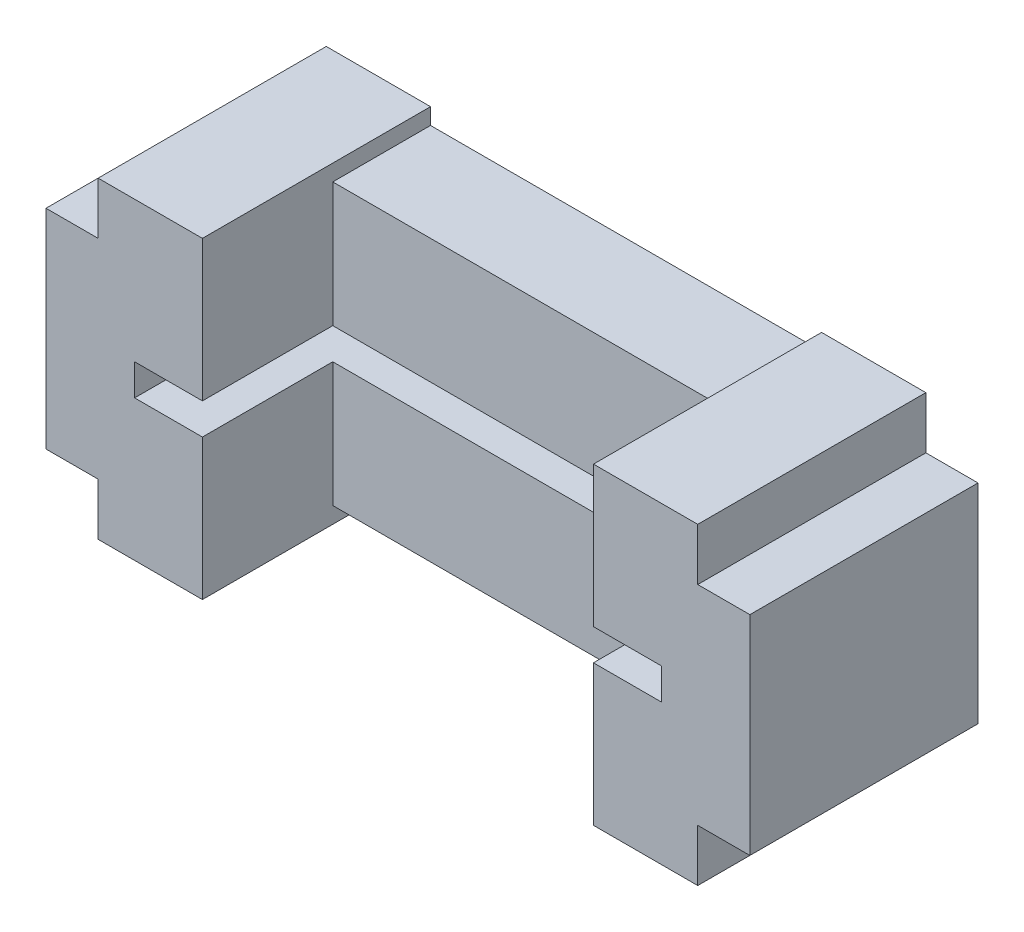
ISO-10303-21;
HEADER;
FILE_DESCRIPTION(('STEP AP214'),'2;1');
FILE_NAME('part.step','',(''),(''),'','','');
FILE_SCHEMA(('AUTOMOTIVE_DESIGN { 1 0 10303 214 1 1 1 1 }'));
ENDSEC;
DATA;
#1=APPLICATION_CONTEXT('core data for automotive mechanical design processes');
#2=APPLICATION_PROTOCOL_DEFINITION('international standard','automotive_design',2000,#1);
#3=PRODUCT_CONTEXT('',#1,'mechanical');
#4=PRODUCT('Part','Part','',(#3));
#5=PRODUCT_RELATED_PRODUCT_CATEGORY('part','',(#4));
#6=PRODUCT_DEFINITION_FORMATION('','',#4);
#7=PRODUCT_DEFINITION_CONTEXT('part definition',#1,'design');
#8=PRODUCT_DEFINITION('design','',#6,#7);
#9=PRODUCT_DEFINITION_SHAPE('','',#8);
#10=(LENGTH_UNIT() NAMED_UNIT(*) SI_UNIT(.MILLI.,.METRE.));
#11=(NAMED_UNIT(*) PLANE_ANGLE_UNIT() SI_UNIT($,.RADIAN.));
#12=(NAMED_UNIT(*) SI_UNIT($,.STERADIAN.) SOLID_ANGLE_UNIT());
#13=UNCERTAINTY_MEASURE_WITH_UNIT(LENGTH_MEASURE(1.E-05),#10,'distance_accuracy_value','');
#14=(GEOMETRIC_REPRESENTATION_CONTEXT(3) GLOBAL_UNCERTAINTY_ASSIGNED_CONTEXT((#13)) GLOBAL_UNIT_ASSIGNED_CONTEXT((#10,
#11,#12)) REPRESENTATION_CONTEXT('',''));
#15=CARTESIAN_POINT('',(0.,0.,0.));
#16=DIRECTION('',(0.,0.,1.));
#17=DIRECTION('',(1.,0.,0.));
#18=AXIS2_PLACEMENT_3D('',#15,#16,#17);
#19=CARTESIAN_POINT('',(-29.21,-15.24,9.525));
#20=DIRECTION('',(0.,1.,0.));
#21=DIRECTION('',(-1.,0.,0.));
#22=AXIS2_PLACEMENT_3D('',#19,#20,#21);
#23=PLANE('',#22);
#24=DIRECTION('',(1.,0.,0.));
#25=VECTOR('',#24,1.);
#26=CARTESIAN_POINT('',(-29.21,-15.24,0.));
#27=LINE('',#26,#25);
#28=CARTESIAN_POINT('',(-29.21,-15.24,0.));
#29=VERTEX_POINT('',#28);
#30=CARTESIAN_POINT('',(-19.05,-15.24,0.));
#31=VERTEX_POINT('',#30);
#32=EDGE_CURVE('E385',#29,#31,#27,.T.);
#33=ORIENTED_EDGE('',*,*,#32,.T.);
#34=DIRECTION('',(0.,0.,-1.));
#35=VECTOR('',#34,1.);
#36=CARTESIAN_POINT('',(-19.05,-15.24,22.225));
#37=LINE('',#36,#35);
#38=CARTESIAN_POINT('',(-19.05,-15.24,22.225));
#39=VERTEX_POINT('',#38);
#40=EDGE_CURVE('E358',#39,#31,#37,.T.);
#41=ORIENTED_EDGE('',*,*,#40,.F.);
#42=DIRECTION('',(1.,0.,0.));
#43=VECTOR('',#42,1.);
#44=CARTESIAN_POINT('',(-29.21,-15.24,22.225));
#45=LINE('',#44,#43);
#46=CARTESIAN_POINT('',(-29.21,-15.24,22.225));
#47=VERTEX_POINT('',#46);
#48=EDGE_CURVE('E356',#47,#39,#45,.T.);
#49=ORIENTED_EDGE('',*,*,#48,.F.);
#50=DIRECTION('',(0.,0.,-1.));
#51=VECTOR('',#50,1.);
#52=CARTESIAN_POINT('',(-29.21,-15.24,9.525));
#53=LINE('',#52,#51);
#54=EDGE_CURVE('E422',#47,#29,#53,.T.);
#55=ORIENTED_EDGE('',*,*,#54,.T.);
#56=EDGE_LOOP('',(#33,#41,#49,#55));
#57=FACE_BOUND('',#56,.T.);
#58=ADVANCED_FACE('F33',(#57),#23,.F.);
#59=CARTESIAN_POINT('',(-29.21,15.24,9.525));
#60=DIRECTION('',(0.,-1.,0.));
#61=DIRECTION('',(1.,0.,0.));
#62=AXIS2_PLACEMENT_3D('',#59,#60,#61);
#63=PLANE('',#62);
#64=DIRECTION('',(0.,0.,-1.));
#65=VECTOR('',#64,1.);
#66=CARTESIAN_POINT('',(-19.05,15.24,22.225));
#67=LINE('',#66,#65);
#68=CARTESIAN_POINT('',(-19.05,15.24,22.225));
#69=VERTEX_POINT('',#68);
#70=CARTESIAN_POINT('',(-19.05,15.24,0.));
#71=VERTEX_POINT('',#70);
#72=EDGE_CURVE('E362',#69,#71,#67,.T.);
#73=ORIENTED_EDGE('',*,*,#72,.T.);
#74=DIRECTION('',(-1.,0.,0.));
#75=VECTOR('',#74,1.);
#76=CARTESIAN_POINT('',(-29.21,15.24,0.));
#77=LINE('',#76,#75);
#78=CARTESIAN_POINT('',(-29.21,15.24,0.));
#79=VERTEX_POINT('',#78);
#80=EDGE_CURVE('E240',#71,#79,#77,.T.);
#81=ORIENTED_EDGE('',*,*,#80,.T.);
#82=DIRECTION('',(0.,0.,-1.));
#83=VECTOR('',#82,1.);
#84=CARTESIAN_POINT('',(-29.21,15.24,9.525));
#85=LINE('',#84,#83);
#86=CARTESIAN_POINT('',(-29.21,15.24,22.225));
#87=VERTEX_POINT('',#86);
#88=EDGE_CURVE('E401',#87,#79,#85,.T.);
#89=ORIENTED_EDGE('',*,*,#88,.F.);
#90=DIRECTION('',(-1.,0.,0.));
#91=VECTOR('',#90,1.);
#92=CARTESIAN_POINT('',(-29.21,15.24,22.225));
#93=LINE('',#92,#91);
#94=EDGE_CURVE('E338',#69,#87,#93,.T.);
#95=ORIENTED_EDGE('',*,*,#94,.F.);
#96=EDGE_LOOP('',(#73,#81,#89,#95));
#97=FACE_BOUND('',#96,.T.);
#98=ADVANCED_FACE('F474',(#97),#63,.F.);
#99=CARTESIAN_POINT('',(0.,0.,9.525));
#100=DIRECTION('',(0.,0.,1.));
#101=DIRECTION('',(1.,0.,0.));
#102=AXIS2_PLACEMENT_3D('',#99,#100,#101);
#103=PLANE('',#102);
#104=DIRECTION('',(1.,0.,0.));
#105=VECTOR('',#104,1.);
#106=CARTESIAN_POINT('',(0.,13.6525,9.525));
#107=LINE('',#106,#105);
#108=CARTESIAN_POINT('',(-19.05,13.6525,9.525));
#109=VERTEX_POINT('',#108);
#110=CARTESIAN_POINT('',(19.05,13.6525,9.525));
#111=VERTEX_POINT('',#110);
#112=EDGE_CURVE('E248',#109,#111,#107,.T.);
#113=ORIENTED_EDGE('',*,*,#112,.F.);
#114=DIRECTION('',(0.,1.,0.));
#115=VECTOR('',#114,1.);
#116=CARTESIAN_POINT('',(-19.05,15.24,9.525));
#117=LINE('',#116,#115);
#118=CARTESIAN_POINT('',(-19.05,1.524,9.525));
#119=VERTEX_POINT('',#118);
#120=EDGE_CURVE('E228',#119,#109,#117,.T.);
#121=ORIENTED_EDGE('',*,*,#120,.F.);
#122=DIRECTION('',(-1.,0.,0.));
#123=VECTOR('',#122,1.);
#124=CARTESIAN_POINT('',(-25.654,1.524,9.525));
#125=LINE('',#124,#123);
#126=CARTESIAN_POINT('',(19.05,1.524,9.525));
#127=VERTEX_POINT('',#126);
#128=EDGE_CURVE('E266',#127,#119,#125,.T.);
#129=ORIENTED_EDGE('',*,*,#128,.F.);
#130=DIRECTION('',(0.,-1.,0.));
#131=VECTOR('',#130,1.);
#132=CARTESIAN_POINT('',(19.05,15.24,9.525));
#133=LINE('',#132,#131);
#134=EDGE_CURVE('E282',#111,#127,#133,.T.);
#135=ORIENTED_EDGE('',*,*,#134,.F.);
#136=EDGE_LOOP('',(#113,#121,#129,#135));
#137=FACE_BOUND('',#136,.T.);
#138=ADVANCED_FACE('F491',(#137),#103,.T.);
#139=DIRECTION('',(-1.,0.,0.));
#140=VECTOR('',#139,1.);
#141=CARTESIAN_POINT('',(0.,-13.6525,9.525));
#142=LINE('',#141,#140);
#143=CARTESIAN_POINT('',(19.05,-13.6525,9.525));
#144=VERTEX_POINT('',#143);
#145=CARTESIAN_POINT('',(-19.05,-13.6525,9.525));
#146=VERTEX_POINT('',#145);
#147=EDGE_CURVE('E259',#144,#146,#142,.T.);
#148=ORIENTED_EDGE('',*,*,#147,.F.);
#149=DIRECTION('',(0.,-1.,0.));
#150=VECTOR('',#149,1.);
#151=CARTESIAN_POINT('',(19.05,-1.524,9.525));
#152=LINE('',#151,#150);
#153=CARTESIAN_POINT('',(19.05,-1.524,9.525));
#154=VERTEX_POINT('',#153);
#155=EDGE_CURVE('E275',#154,#144,#152,.T.);
#156=ORIENTED_EDGE('',*,*,#155,.F.);
#157=DIRECTION('',(1.,0.,0.));
#158=VECTOR('',#157,1.);
#159=CARTESIAN_POINT('',(-25.654,-1.524,9.525));
#160=LINE('',#159,#158);
#161=CARTESIAN_POINT('',(-19.05,-1.524,9.525));
#162=VERTEX_POINT('',#161);
#163=EDGE_CURVE('E261',#162,#154,#160,.T.);
#164=ORIENTED_EDGE('',*,*,#163,.F.);
#165=DIRECTION('',(0.,1.,0.));
#166=VECTOR('',#165,1.);
#167=CARTESIAN_POINT('',(-19.05,-1.524,9.525));
#168=LINE('',#167,#166);
#169=EDGE_CURVE('E327',#146,#162,#168,.T.);
#170=ORIENTED_EDGE('',*,*,#169,.F.);
#171=EDGE_LOOP('',(#148,#156,#164,#170));
#172=FACE_BOUND('',#171,.T.);
#173=ADVANCED_FACE('F484',(#172),#103,.T.);
#174=CARTESIAN_POINT('',(-29.21,15.24,9.525));
#175=DIRECTION('',(1.,0.,0.));
#176=DIRECTION('',(0.,0.,-1.));
#177=AXIS2_PLACEMENT_3D('',#174,#175,#176);
#178=PLANE('',#177);
#179=DIRECTION('',(0.,-1.,0.));
#180=VECTOR('',#179,1.);
#181=CARTESIAN_POINT('',(-29.21,15.24,0.));
#182=LINE('',#181,#180);
#183=CARTESIAN_POINT('',(-29.21,10.16,0.));
#184=VERTEX_POINT('',#183);
#185=EDGE_CURVE('E373',#79,#184,#182,.T.);
#186=ORIENTED_EDGE('',*,*,#185,.T.);
#187=DIRECTION('',(0.,0.,-1.));
#188=VECTOR('',#187,1.);
#189=CARTESIAN_POINT('',(-29.21,10.16,9.525));
#190=LINE('',#189,#188);
#191=CARTESIAN_POINT('',(-29.21,10.16,22.225));
#192=VERTEX_POINT('',#191);
#193=EDGE_CURVE('E11',#192,#184,#190,.T.);
#194=ORIENTED_EDGE('',*,*,#193,.F.);
#195=DIRECTION('',(0.,-1.,0.));
#196=VECTOR('',#195,1.);
#197=CARTESIAN_POINT('',(-29.21,15.24,22.225));
#198=LINE('',#197,#196);
#199=EDGE_CURVE('E341',#87,#192,#198,.T.);
#200=ORIENTED_EDGE('',*,*,#199,.F.);
#201=ORIENTED_EDGE('',*,*,#88,.T.);
#202=EDGE_LOOP('',(#186,#194,#200,#201));
#203=FACE_BOUND('',#202,.T.);
#204=ADVANCED_FACE('F35',(#203),#178,.F.);
#205=CARTESIAN_POINT('',(-34.29,10.16,9.525));
#206=DIRECTION('',(0.,-1.,0.));
#207=DIRECTION('',(0.,0.,-1.));
#208=AXIS2_PLACEMENT_3D('',#205,#206,#207);
#209=PLANE('',#208);
#210=DIRECTION('',(-1.,0.,0.));
#211=VECTOR('',#210,1.);
#212=CARTESIAN_POINT('',(-34.29,10.16,0.));
#213=LINE('',#212,#211);
#214=CARTESIAN_POINT('',(-34.29,10.16,0.));
#215=VERTEX_POINT('',#214);
#216=EDGE_CURVE('E376',#184,#215,#213,.T.);
#217=ORIENTED_EDGE('',*,*,#216,.T.);
#218=DIRECTION('',(0.,0.,-1.));
#219=VECTOR('',#218,1.);
#220=CARTESIAN_POINT('',(-34.29,10.16,9.525));
#221=LINE('',#220,#219);
#222=CARTESIAN_POINT('',(-34.29,10.16,22.225));
#223=VERTEX_POINT('',#222);
#224=EDGE_CURVE('E41',#223,#215,#221,.T.);
#225=ORIENTED_EDGE('',*,*,#224,.F.);
#226=DIRECTION('',(-1.,0.,0.));
#227=VECTOR('',#226,1.);
#228=CARTESIAN_POINT('',(-34.29,10.16,22.225));
#229=LINE('',#228,#227);
#230=EDGE_CURVE('E344',#192,#223,#229,.T.);
#231=ORIENTED_EDGE('',*,*,#230,.F.);
#232=ORIENTED_EDGE('',*,*,#193,.T.);
#233=EDGE_LOOP('',(#217,#225,#231,#232));
#234=FACE_BOUND('',#233,.T.);
#235=ADVANCED_FACE('F477',(#234),#209,.F.);
#236=CARTESIAN_POINT('',(-34.29,-10.16,9.525));
#237=DIRECTION('',(1.,0.,0.));
#238=DIRECTION('',(0.,1.,0.));
#239=AXIS2_PLACEMENT_3D('',#236,#237,#238);
#240=PLANE('',#239);
#241=DIRECTION('',(0.,-1.,0.));
#242=VECTOR('',#241,1.);
#243=CARTESIAN_POINT('',(-34.29,-10.16,0.));
#244=LINE('',#243,#242);
#245=CARTESIAN_POINT('',(-34.29,-10.16,0.));
#246=VERTEX_POINT('',#245);
#247=EDGE_CURVE('E378',#215,#246,#244,.T.);
#248=ORIENTED_EDGE('',*,*,#247,.T.);
#249=DIRECTION('',(0.,0.,-1.));
#250=VECTOR('',#249,1.);
#251=CARTESIAN_POINT('',(-34.29,-10.16,9.525));
#252=LINE('',#251,#250);
#253=CARTESIAN_POINT('',(-34.29,-10.16,22.225));
#254=VERTEX_POINT('',#253);
#255=EDGE_CURVE('E428',#254,#246,#252,.T.);
#256=ORIENTED_EDGE('',*,*,#255,.F.);
#257=DIRECTION('',(0.,-1.,0.));
#258=VECTOR('',#257,1.);
#259=CARTESIAN_POINT('',(-34.29,10.16,22.225));
#260=LINE('',#259,#258);
#261=EDGE_CURVE('E347',#223,#254,#260,.T.);
#262=ORIENTED_EDGE('',*,*,#261,.F.);
#263=ORIENTED_EDGE('',*,*,#224,.T.);
#264=EDGE_LOOP('',(#248,#256,#262,#263));
#265=FACE_BOUND('',#264,.T.);
#266=ADVANCED_FACE('F434',(#265),#240,.F.);
#267=CARTESIAN_POINT('',(-34.29,-10.16,9.525));
#268=DIRECTION('',(0.,1.,0.));
#269=DIRECTION('',(0.,0.,1.));
#270=AXIS2_PLACEMENT_3D('',#267,#268,#269);
#271=PLANE('',#270);
#272=DIRECTION('',(1.,0.,0.));
#273=VECTOR('',#272,1.);
#274=CARTESIAN_POINT('',(-34.29,-10.16,0.));
#275=LINE('',#274,#273);
#276=CARTESIAN_POINT('',(-29.21,-10.16,0.));
#277=VERTEX_POINT('',#276);
#278=EDGE_CURVE('E380',#246,#277,#275,.T.);
#279=ORIENTED_EDGE('',*,*,#278,.T.);
#280=DIRECTION('',(0.,0.,-1.));
#281=VECTOR('',#280,1.);
#282=CARTESIAN_POINT('',(-29.21,-10.16,9.525));
#283=LINE('',#282,#281);
#284=CARTESIAN_POINT('',(-29.21,-10.16,22.225));
#285=VERTEX_POINT('',#284);
#286=EDGE_CURVE('E425',#285,#277,#283,.T.);
#287=ORIENTED_EDGE('',*,*,#286,.F.);
#288=DIRECTION('',(1.,0.,0.));
#289=VECTOR('',#288,1.);
#290=CARTESIAN_POINT('',(-29.21,-10.16,22.225));
#291=LINE('',#290,#289);
#292=EDGE_CURVE('E350',#254,#285,#291,.T.);
#293=ORIENTED_EDGE('',*,*,#292,.F.);
#294=ORIENTED_EDGE('',*,*,#255,.T.);
#295=EDGE_LOOP('',(#279,#287,#293,#294));
#296=FACE_BOUND('',#295,.T.);
#297=ADVANCED_FACE('F441',(#296),#271,.F.);
#298=CARTESIAN_POINT('',(-29.21,-15.24,9.525));
#299=DIRECTION('',(1.,0.,0.));
#300=DIRECTION('',(0.,0.,-1.));
#301=AXIS2_PLACEMENT_3D('',#298,#299,#300);
#302=PLANE('',#301);
#303=DIRECTION('',(0.,-1.,0.));
#304=VECTOR('',#303,1.);
#305=CARTESIAN_POINT('',(-29.21,-15.24,0.));
#306=LINE('',#305,#304);
#307=EDGE_CURVE('E382',#277,#29,#306,.T.);
#308=ORIENTED_EDGE('',*,*,#307,.T.);
#309=ORIENTED_EDGE('',*,*,#54,.F.);
#310=DIRECTION('',(0.,-1.,0.));
#311=VECTOR('',#310,1.);
#312=CARTESIAN_POINT('',(-29.21,-10.16,22.225));
#313=LINE('',#312,#311);
#314=EDGE_CURVE('E353',#285,#47,#313,.T.);
#315=ORIENTED_EDGE('',*,*,#314,.F.);
#316=ORIENTED_EDGE('',*,*,#286,.T.);
#317=EDGE_LOOP('',(#308,#309,#315,#316));
#318=FACE_BOUND('',#317,.T.);
#319=ADVANCED_FACE('F445',(#318),#302,.F.);
#320=DIRECTION('',(0.,0.,-1.));
#321=VECTOR('',#320,1.);
#322=CARTESIAN_POINT('',(19.05,-15.24,22.225));
#323=LINE('',#322,#321);
#324=CARTESIAN_POINT('',(19.05,-15.24,22.225));
#325=VERTEX_POINT('',#324);
#326=CARTESIAN_POINT('',(19.05,-15.24,0.));
#327=VERTEX_POINT('',#326);
#328=EDGE_CURVE('E322',#325,#327,#323,.T.);
#329=ORIENTED_EDGE('',*,*,#328,.T.);
#330=CARTESIAN_POINT('',(29.21,-15.24,0.));
#331=VERTEX_POINT('',#330);
#332=EDGE_CURVE('E384',#327,#331,#27,.T.);
#333=ORIENTED_EDGE('',*,*,#332,.T.);
#334=DIRECTION('',(0.,0.,-1.));
#335=VECTOR('',#334,1.);
#336=CARTESIAN_POINT('',(29.21,-15.24,9.525));
#337=LINE('',#336,#335);
#338=CARTESIAN_POINT('',(29.21,-15.24,22.225));
#339=VERTEX_POINT('',#338);
#340=EDGE_CURVE('E419',#339,#331,#337,.T.);
#341=ORIENTED_EDGE('',*,*,#340,.F.);
#342=DIRECTION('',(1.,0.,0.));
#343=VECTOR('',#342,1.);
#344=CARTESIAN_POINT('',(29.21,-15.24,22.225));
#345=LINE('',#344,#343);
#346=EDGE_CURVE('E284',#325,#339,#345,.T.);
#347=ORIENTED_EDGE('',*,*,#346,.F.);
#348=EDGE_LOOP('',(#329,#333,#341,#347));
#349=FACE_BOUND('',#348,.T.);
#350=ADVANCED_FACE('F487',(#349),#23,.F.);
#351=CARTESIAN_POINT('',(29.21,-15.24,9.525));
#352=DIRECTION('',(-1.,0.,0.));
#353=DIRECTION('',(0.,0.,1.));
#354=AXIS2_PLACEMENT_3D('',#351,#352,#353);
#355=PLANE('',#354);
#356=DIRECTION('',(0.,1.,0.));
#357=VECTOR('',#356,1.);
#358=CARTESIAN_POINT('',(29.21,-15.24,0.));
#359=LINE('',#358,#357);
#360=CARTESIAN_POINT('',(29.21,-10.16,0.));
#361=VERTEX_POINT('',#360);
#362=EDGE_CURVE('E388',#331,#361,#359,.T.);
#363=ORIENTED_EDGE('',*,*,#362,.T.);
#364=DIRECTION('',(0.,0.,-1.));
#365=VECTOR('',#364,1.);
#366=CARTESIAN_POINT('',(29.21,-10.16,9.525));
#367=LINE('',#366,#365);
#368=CARTESIAN_POINT('',(29.21,-10.16,22.225));
#369=VERTEX_POINT('',#368);
#370=EDGE_CURVE('E416',#369,#361,#367,.T.);
#371=ORIENTED_EDGE('',*,*,#370,.F.);
#372=DIRECTION('',(0.,1.,0.));
#373=VECTOR('',#372,1.);
#374=CARTESIAN_POINT('',(29.21,-15.24,22.225));
#375=LINE('',#374,#373);
#376=EDGE_CURVE('E287',#339,#369,#375,.T.);
#377=ORIENTED_EDGE('',*,*,#376,.F.);
#378=ORIENTED_EDGE('',*,*,#340,.T.);
#379=EDGE_LOOP('',(#363,#371,#377,#378));
#380=FACE_BOUND('',#379,.T.);
#381=ADVANCED_FACE('F497',(#380),#355,.F.);
#382=CARTESIAN_POINT('',(34.29,-10.16,9.525));
#383=DIRECTION('',(0.,1.,0.));
#384=DIRECTION('',(0.,0.,1.));
#385=AXIS2_PLACEMENT_3D('',#382,#383,#384);
#386=PLANE('',#385);
#387=DIRECTION('',(1.,0.,0.));
#388=VECTOR('',#387,1.);
#389=CARTESIAN_POINT('',(34.29,-10.16,0.));
#390=LINE('',#389,#388);
#391=CARTESIAN_POINT('',(34.29,-10.16,0.));
#392=VERTEX_POINT('',#391);
#393=EDGE_CURVE('E390',#361,#392,#390,.T.);
#394=ORIENTED_EDGE('',*,*,#393,.T.);
#395=DIRECTION('',(0.,0.,-1.));
#396=VECTOR('',#395,1.);
#397=CARTESIAN_POINT('',(34.29,-10.16,9.525));
#398=LINE('',#397,#396);
#399=CARTESIAN_POINT('',(34.29,-10.16,22.225));
#400=VERTEX_POINT('',#399);
#401=EDGE_CURVE('E413',#400,#392,#398,.T.);
#402=ORIENTED_EDGE('',*,*,#401,.F.);
#403=DIRECTION('',(1.,0.,0.));
#404=VECTOR('',#403,1.);
#405=CARTESIAN_POINT('',(34.29,-10.16,22.225));
#406=LINE('',#405,#404);
#407=EDGE_CURVE('E290',#369,#400,#406,.T.);
#408=ORIENTED_EDGE('',*,*,#407,.F.);
#409=ORIENTED_EDGE('',*,*,#370,.T.);
#410=EDGE_LOOP('',(#394,#402,#408,#409));
#411=FACE_BOUND('',#410,.T.);
#412=ADVANCED_FACE('F503',(#411),#386,.F.);
#413=CARTESIAN_POINT('',(34.29,-10.16,9.525));
#414=DIRECTION('',(-1.,0.,0.));
#415=DIRECTION('',(0.,-1.,0.));
#416=AXIS2_PLACEMENT_3D('',#413,#414,#415);
#417=PLANE('',#416);
#418=DIRECTION('',(0.,1.,0.));
#419=VECTOR('',#418,1.);
#420=CARTESIAN_POINT('',(34.29,-10.16,0.));
#421=LINE('',#420,#419);
#422=CARTESIAN_POINT('',(34.29,10.16,0.));
#423=VERTEX_POINT('',#422);
#424=EDGE_CURVE('E392',#392,#423,#421,.T.);
#425=ORIENTED_EDGE('',*,*,#424,.T.);
#426=DIRECTION('',(0.,0.,-1.));
#427=VECTOR('',#426,1.);
#428=CARTESIAN_POINT('',(34.29,10.16,9.525));
#429=LINE('',#428,#427);
#430=CARTESIAN_POINT('',(34.29,10.16,22.225));
#431=VERTEX_POINT('',#430);
#432=EDGE_CURVE('E410',#431,#423,#429,.T.);
#433=ORIENTED_EDGE('',*,*,#432,.F.);
#434=DIRECTION('',(0.,1.,0.));
#435=VECTOR('',#434,1.);
#436=CARTESIAN_POINT('',(34.29,10.16,22.225));
#437=LINE('',#436,#435);
#438=EDGE_CURVE('E293',#400,#431,#437,.T.);
#439=ORIENTED_EDGE('',*,*,#438,.F.);
#440=ORIENTED_EDGE('',*,*,#401,.T.);
#441=EDGE_LOOP('',(#425,#433,#439,#440));
#442=FACE_BOUND('',#441,.T.);
#443=ADVANCED_FACE('F522',(#442),#417,.F.);
#444=CARTESIAN_POINT('',(34.29,10.16,9.525));
#445=DIRECTION('',(0.,-1.,0.));
#446=DIRECTION('',(0.,0.,-1.));
#447=AXIS2_PLACEMENT_3D('',#444,#445,#446);
#448=PLANE('',#447);
#449=DIRECTION('',(-1.,0.,0.));
#450=VECTOR('',#449,1.);
#451=CARTESIAN_POINT('',(34.29,10.16,0.));
#452=LINE('',#451,#450);
#453=CARTESIAN_POINT('',(29.21,10.16,0.));
#454=VERTEX_POINT('',#453);
#455=EDGE_CURVE('E394',#423,#454,#452,.T.);
#456=ORIENTED_EDGE('',*,*,#455,.T.);
#457=DIRECTION('',(0.,0.,-1.));
#458=VECTOR('',#457,1.);
#459=CARTESIAN_POINT('',(29.21,10.16,9.525));
#460=LINE('',#459,#458);
#461=CARTESIAN_POINT('',(29.21,10.16,22.225));
#462=VERTEX_POINT('',#461);
#463=EDGE_CURVE('E407',#462,#454,#460,.T.);
#464=ORIENTED_EDGE('',*,*,#463,.F.);
#465=DIRECTION('',(-1.,0.,0.));
#466=VECTOR('',#465,1.);
#467=CARTESIAN_POINT('',(34.29,10.16,22.225));
#468=LINE('',#467,#466);
#469=EDGE_CURVE('E296',#431,#462,#468,.T.);
#470=ORIENTED_EDGE('',*,*,#469,.F.);
#471=ORIENTED_EDGE('',*,*,#432,.T.);
#472=EDGE_LOOP('',(#456,#464,#470,#471));
#473=FACE_BOUND('',#472,.T.);
#474=ADVANCED_FACE('F525',(#473),#448,.F.);
#475=CARTESIAN_POINT('',(29.21,15.24,9.525));
#476=DIRECTION('',(-1.,0.,0.));
#477=DIRECTION('',(0.,0.,1.));
#478=AXIS2_PLACEMENT_3D('',#475,#476,#477);
#479=PLANE('',#478);
#480=DIRECTION('',(0.,1.,0.));
#481=VECTOR('',#480,1.);
#482=CARTESIAN_POINT('',(29.21,15.24,0.));
#483=LINE('',#482,#481);
#484=CARTESIAN_POINT('',(29.21,15.24,0.));
#485=VERTEX_POINT('',#484);
#486=EDGE_CURVE('E396',#454,#485,#483,.T.);
#487=ORIENTED_EDGE('',*,*,#486,.T.);
#488=DIRECTION('',(0.,0.,-1.));
#489=VECTOR('',#488,1.);
#490=CARTESIAN_POINT('',(29.21,15.24,9.525));
#491=LINE('',#490,#489);
#492=CARTESIAN_POINT('',(29.21,15.24,22.225));
#493=VERTEX_POINT('',#492);
#494=EDGE_CURVE('E404',#493,#485,#491,.T.);
#495=ORIENTED_EDGE('',*,*,#494,.F.);
#496=DIRECTION('',(0.,1.,0.));
#497=VECTOR('',#496,1.);
#498=CARTESIAN_POINT('',(29.21,15.24,22.225));
#499=LINE('',#498,#497);
#500=EDGE_CURVE('E299',#462,#493,#499,.T.);
#501=ORIENTED_EDGE('',*,*,#500,.F.);
#502=ORIENTED_EDGE('',*,*,#463,.T.);
#503=EDGE_LOOP('',(#487,#495,#501,#502));
#504=FACE_BOUND('',#503,.T.);
#505=ADVANCED_FACE('F529',(#504),#479,.F.);
#506=CARTESIAN_POINT('',(19.05,15.24,0.));
#507=VERTEX_POINT('',#506);
#508=EDGE_CURVE('E398',#485,#507,#77,.T.);
#509=ORIENTED_EDGE('',*,*,#508,.T.);
#510=DIRECTION('',(0.,0.,-1.));
#511=VECTOR('',#510,1.);
#512=CARTESIAN_POINT('',(19.05,15.24,22.225));
#513=LINE('',#512,#511);
#514=CARTESIAN_POINT('',(19.05,15.24,22.225));
#515=VERTEX_POINT('',#514);
#516=EDGE_CURVE('E320',#515,#507,#513,.T.);
#517=ORIENTED_EDGE('',*,*,#516,.F.);
#518=DIRECTION('',(-1.,0.,0.));
#519=VECTOR('',#518,1.);
#520=CARTESIAN_POINT('',(29.21,15.24,22.225));
#521=LINE('',#520,#519);
#522=EDGE_CURVE('E302',#493,#515,#521,.T.);
#523=ORIENTED_EDGE('',*,*,#522,.F.);
#524=ORIENTED_EDGE('',*,*,#494,.T.);
#525=EDGE_LOOP('',(#509,#517,#523,#524));
#526=FACE_BOUND('',#525,.T.);
#527=ADVANCED_FACE('F493',(#526),#63,.F.);
#528=CARTESIAN_POINT('',(0.,0.,0.));
#529=DIRECTION('',(0.,0.,1.));
#530=DIRECTION('',(1.,0.,0.));
#531=AXIS2_PLACEMENT_3D('',#528,#529,#530);
#532=PLANE('',#531);
#533=ORIENTED_EDGE('',*,*,#80,.F.);
#534=DIRECTION('',(0.,-1.,0.));
#535=VECTOR('',#534,1.);
#536=CARTESIAN_POINT('',(-19.05,15.24,0.));
#537=LINE('',#536,#535);
#538=CARTESIAN_POINT('',(-19.05,13.6525,0.));
#539=VERTEX_POINT('',#538);
#540=EDGE_CURVE('E224',#71,#539,#537,.T.);
#541=ORIENTED_EDGE('',*,*,#540,.T.);
#542=DIRECTION('',(1.,0.,0.));
#543=VECTOR('',#542,1.);
#544=CARTESIAN_POINT('',(-19.05,13.6525,0.));
#545=LINE('',#544,#543);
#546=CARTESIAN_POINT('',(19.05,13.6525,0.));
#547=VERTEX_POINT('',#546);
#548=EDGE_CURVE('E234',#539,#547,#545,.T.);
#549=ORIENTED_EDGE('',*,*,#548,.T.);
#550=DIRECTION('',(0.,1.,0.));
#551=VECTOR('',#550,1.);
#552=CARTESIAN_POINT('',(19.05,15.24,0.));
#553=LINE('',#552,#551);
#554=EDGE_CURVE('E48',#547,#507,#553,.T.);
#555=ORIENTED_EDGE('',*,*,#554,.T.);
#556=ORIENTED_EDGE('',*,*,#508,.F.);
#557=ORIENTED_EDGE('',*,*,#486,.F.);
#558=ORIENTED_EDGE('',*,*,#455,.F.);
#559=ORIENTED_EDGE('',*,*,#424,.F.);
#560=ORIENTED_EDGE('',*,*,#393,.F.);
#561=ORIENTED_EDGE('',*,*,#362,.F.);
#562=ORIENTED_EDGE('',*,*,#332,.F.);
#563=DIRECTION('',(0.,1.,0.));
#564=VECTOR('',#563,1.);
#565=CARTESIAN_POINT('',(19.05,-15.24,0.));
#566=LINE('',#565,#564);
#567=CARTESIAN_POINT('',(19.05,-13.6525,0.));
#568=VERTEX_POINT('',#567);
#569=EDGE_CURVE('E250',#327,#568,#566,.T.);
#570=ORIENTED_EDGE('',*,*,#569,.T.);
#571=DIRECTION('',(-1.,0.,0.));
#572=VECTOR('',#571,1.);
#573=CARTESIAN_POINT('',(-19.05,-13.6525,0.));
#574=LINE('',#573,#572);
#575=CARTESIAN_POINT('',(-19.05,-13.6525,0.));
#576=VERTEX_POINT('',#575);
#577=EDGE_CURVE('E56',#568,#576,#574,.T.);
#578=ORIENTED_EDGE('',*,*,#577,.T.);
#579=DIRECTION('',(0.,-1.,0.));
#580=VECTOR('',#579,1.);
#581=CARTESIAN_POINT('',(-19.05,-15.24,0.));
#582=LINE('',#581,#580);
#583=EDGE_CURVE('E254',#576,#31,#582,.T.);
#584=ORIENTED_EDGE('',*,*,#583,.T.);
#585=ORIENTED_EDGE('',*,*,#32,.F.);
#586=ORIENTED_EDGE('',*,*,#307,.F.);
#587=ORIENTED_EDGE('',*,*,#278,.F.);
#588=ORIENTED_EDGE('',*,*,#247,.F.);
#589=ORIENTED_EDGE('',*,*,#216,.F.);
#590=ORIENTED_EDGE('',*,*,#185,.F.);
#591=EDGE_LOOP('',(#533,#541,#549,#555,#556,#557,#558,#559,#560,#561,#562,#570,#578,#584,#585,
#586,#587,#588,#589,#590));
#592=FACE_BOUND('',#591,.T.);
#593=ADVANCED_FACE('F238',(#592),#532,.F.);
#594=CARTESIAN_POINT('',(-19.05,-1.524,22.225));
#595=DIRECTION('',(-1.,0.,0.));
#596=DIRECTION('',(0.,-1.,0.));
#597=AXIS2_PLACEMENT_3D('',#594,#595,#596);
#598=PLANE('',#597);
#599=DIRECTION('',(0.,0.,-1.));
#600=VECTOR('',#599,1.);
#601=CARTESIAN_POINT('',(-19.05,-1.524,22.225));
#602=LINE('',#601,#600);
#603=CARTESIAN_POINT('',(-19.05,-1.524,22.225));
#604=VERTEX_POINT('',#603);
#605=EDGE_CURVE('E370',#604,#162,#602,.T.);
#606=ORIENTED_EDGE('',*,*,#605,.F.);
#607=DIRECTION('',(0.,1.,0.));
#608=VECTOR('',#607,1.);
#609=CARTESIAN_POINT('',(-19.05,-1.524,22.225));
#610=LINE('',#609,#608);
#611=EDGE_CURVE('E328',#39,#604,#610,.T.);
#612=ORIENTED_EDGE('',*,*,#611,.F.);
#613=ORIENTED_EDGE('',*,*,#40,.T.);
#614=ORIENTED_EDGE('',*,*,#583,.F.);
#615=DIRECTION('',(0.,0.,1.));
#616=VECTOR('',#615,1.);
#617=CARTESIAN_POINT('',(-19.05,-13.6525,0.));
#618=LINE('',#617,#616);
#619=EDGE_CURVE('E241',#576,#146,#618,.T.);
#620=ORIENTED_EDGE('',*,*,#619,.T.);
#621=ORIENTED_EDGE('',*,*,#169,.T.);
#622=EDGE_LOOP('',(#606,#612,#613,#614,#620,#621));
#623=FACE_BOUND('',#622,.T.);
#624=ADVANCED_FACE('F455',(#623),#598,.F.);
#625=CARTESIAN_POINT('',(-19.05,-1.524,22.225));
#626=DIRECTION('',(0.,-1.,0.));
#627=DIRECTION('',(1.,0.,0.));
#628=AXIS2_PLACEMENT_3D('',#625,#626,#627);
#629=PLANE('',#628);
#630=ORIENTED_EDGE('',*,*,#605,.T.);
#631=ORIENTED_EDGE('',*,*,#163,.T.);
#632=DIRECTION('',(0.,0.,-1.));
#633=VECTOR('',#632,1.);
#634=CARTESIAN_POINT('',(19.05,-1.524,22.225));
#635=LINE('',#634,#633);
#636=CARTESIAN_POINT('',(19.05,-1.524,22.225));
#637=VERTEX_POINT('',#636);
#638=EDGE_CURVE('E324',#637,#154,#635,.T.);
#639=ORIENTED_EDGE('',*,*,#638,.F.);
#640=DIRECTION('',(-1.,0.,0.));
#641=VECTOR('',#640,1.);
#642=CARTESIAN_POINT('',(19.05,-1.524,22.225));
#643=LINE('',#642,#641);
#644=CARTESIAN_POINT('',(25.654,-1.524,22.225));
#645=VERTEX_POINT('',#644);
#646=EDGE_CURVE('E278',#645,#637,#643,.T.);
#647=ORIENTED_EDGE('',*,*,#646,.F.);
#648=DIRECTION('',(0.,0.,-1.));
#649=VECTOR('',#648,1.);
#650=CARTESIAN_POINT('',(25.654,-1.524,22.225));
#651=LINE('',#650,#649);
#652=CARTESIAN_POINT('',(25.654,-1.524,3.429));
#653=VERTEX_POINT('',#652);
#654=EDGE_CURVE('E310',#645,#653,#651,.T.);
#655=ORIENTED_EDGE('',*,*,#654,.T.);
#656=DIRECTION('',(1.,0.,0.));
#657=VECTOR('',#656,1.);
#658=CARTESIAN_POINT('',(-25.654,-1.524,3.429));
#659=LINE('',#658,#657);
#660=CARTESIAN_POINT('',(-25.654,-1.524,3.429));
#661=VERTEX_POINT('',#660);
#662=EDGE_CURVE('E265',#661,#653,#659,.T.);
#663=ORIENTED_EDGE('',*,*,#662,.F.);
#664=DIRECTION('',(0.,0.,-1.));
#665=VECTOR('',#664,1.);
#666=CARTESIAN_POINT('',(-25.654,-1.524,22.225));
#667=LINE('',#666,#665);
#668=CARTESIAN_POINT('',(-25.654,-1.524,22.225));
#669=VERTEX_POINT('',#668);
#670=EDGE_CURVE('E368',#669,#661,#667,.T.);
#671=ORIENTED_EDGE('',*,*,#670,.F.);
#672=DIRECTION('',(-1.,0.,0.));
#673=VECTOR('',#672,1.);
#674=CARTESIAN_POINT('',(-19.05,-1.524,22.225));
#675=LINE('',#674,#673);
#676=EDGE_CURVE('E330',#604,#669,#675,.T.);
#677=ORIENTED_EDGE('',*,*,#676,.F.);
#678=EDGE_LOOP('',(#630,#631,#639,#647,#655,#663,#671,#677));
#679=FACE_BOUND('',#678,.T.);
#680=ADVANCED_FACE('F459',(#679),#629,.F.);
#681=CARTESIAN_POINT('',(-25.654,1.524,22.225));
#682=DIRECTION('',(-1.,0.,0.));
#683=DIRECTION('',(0.,0.,1.));
#684=AXIS2_PLACEMENT_3D('',#681,#682,#683);
#685=PLANE('',#684);
#686=ORIENTED_EDGE('',*,*,#670,.T.);
#687=DIRECTION('',(0.,-1.,0.));
#688=VECTOR('',#687,1.);
#689=CARTESIAN_POINT('',(-25.654,-1.524,3.429));
#690=LINE('',#689,#688);
#691=CARTESIAN_POINT('',(-25.654,1.524,3.429));
#692=VERTEX_POINT('',#691);
#693=EDGE_CURVE('E262',#692,#661,#690,.T.);
#694=ORIENTED_EDGE('',*,*,#693,.F.);
#695=DIRECTION('',(0.,0.,-1.));
#696=VECTOR('',#695,1.);
#697=CARTESIAN_POINT('',(-25.654,1.524,22.225));
#698=LINE('',#697,#696);
#699=CARTESIAN_POINT('',(-25.654,1.524,22.225));
#700=VERTEX_POINT('',#699);
#701=EDGE_CURVE('E366',#700,#692,#698,.T.);
#702=ORIENTED_EDGE('',*,*,#701,.F.);
#703=DIRECTION('',(0.,1.,0.));
#704=VECTOR('',#703,1.);
#705=CARTESIAN_POINT('',(-25.654,1.524,22.225));
#706=LINE('',#705,#704);
#707=EDGE_CURVE('E332',#669,#700,#706,.T.);
#708=ORIENTED_EDGE('',*,*,#707,.F.);
#709=EDGE_LOOP('',(#686,#694,#702,#708));
#710=FACE_BOUND('',#709,.T.);
#711=ADVANCED_FACE('F465',(#710),#685,.F.);
#712=CARTESIAN_POINT('',(-19.05,1.524,22.225));
#713=DIRECTION('',(0.,1.,0.));
#714=DIRECTION('',(-1.,0.,0.));
#715=AXIS2_PLACEMENT_3D('',#712,#713,#714);
#716=PLANE('',#715);
#717=ORIENTED_EDGE('',*,*,#701,.T.);
#718=DIRECTION('',(-1.,0.,0.));
#719=VECTOR('',#718,1.);
#720=CARTESIAN_POINT('',(-25.654,1.524,3.429));
#721=LINE('',#720,#719);
#722=CARTESIAN_POINT('',(25.654,1.524,3.429));
#723=VERTEX_POINT('',#722);
#724=EDGE_CURVE('E272',#723,#692,#721,.T.);
#725=ORIENTED_EDGE('',*,*,#724,.F.);
#726=DIRECTION('',(0.,0.,-1.));
#727=VECTOR('',#726,1.);
#728=CARTESIAN_POINT('',(25.654,1.524,22.225));
#729=LINE('',#728,#727);
#730=CARTESIAN_POINT('',(25.654,1.524,22.225));
#731=VERTEX_POINT('',#730);
#732=EDGE_CURVE('E315',#731,#723,#729,.T.);
#733=ORIENTED_EDGE('',*,*,#732,.F.);
#734=DIRECTION('',(1.,0.,0.));
#735=VECTOR('',#734,1.);
#736=CARTESIAN_POINT('',(19.05,1.524,22.225));
#737=LINE('',#736,#735);
#738=CARTESIAN_POINT('',(19.05,1.524,22.225));
#739=VERTEX_POINT('',#738);
#740=EDGE_CURVE('E306',#739,#731,#737,.T.);
#741=ORIENTED_EDGE('',*,*,#740,.F.);
#742=DIRECTION('',(0.,0.,-1.));
#743=VECTOR('',#742,1.);
#744=CARTESIAN_POINT('',(19.05,1.524,22.225));
#745=LINE('',#744,#743);
#746=EDGE_CURVE('E317',#739,#127,#745,.T.);
#747=ORIENTED_EDGE('',*,*,#746,.T.);
#748=ORIENTED_EDGE('',*,*,#128,.T.);
#749=DIRECTION('',(0.,0.,-1.));
#750=VECTOR('',#749,1.);
#751=CARTESIAN_POINT('',(-19.05,1.524,22.225));
#752=LINE('',#751,#750);
#753=CARTESIAN_POINT('',(-19.05,1.524,22.225));
#754=VERTEX_POINT('',#753);
#755=EDGE_CURVE('E364',#754,#119,#752,.T.);
#756=ORIENTED_EDGE('',*,*,#755,.F.);
#757=DIRECTION('',(1.,0.,0.));
#758=VECTOR('',#757,1.);
#759=CARTESIAN_POINT('',(-19.05,1.524,22.225));
#760=LINE('',#759,#758);
#761=EDGE_CURVE('E334',#700,#754,#760,.T.);
#762=ORIENTED_EDGE('',*,*,#761,.F.);
#763=EDGE_LOOP('',(#717,#725,#733,#741,#747,#748,#756,#762));
#764=FACE_BOUND('',#763,.T.);
#765=ADVANCED_FACE('F470',(#764),#716,.F.);
#766=CARTESIAN_POINT('',(-19.05,15.24,22.225));
#767=DIRECTION('',(-1.,0.,0.));
#768=DIRECTION('',(0.,-1.,0.));
#769=AXIS2_PLACEMENT_3D('',#766,#767,#768);
#770=PLANE('',#769);
#771=ORIENTED_EDGE('',*,*,#120,.T.);
#772=DIRECTION('',(0.,0.,1.));
#773=VECTOR('',#772,1.);
#774=CARTESIAN_POINT('',(-19.05,13.6525,0.));
#775=LINE('',#774,#773);
#776=EDGE_CURVE('E219',#539,#109,#775,.T.);
#777=ORIENTED_EDGE('',*,*,#776,.F.);
#778=ORIENTED_EDGE('',*,*,#540,.F.);
#779=ORIENTED_EDGE('',*,*,#72,.F.);
#780=DIRECTION('',(0.,1.,0.));
#781=VECTOR('',#780,1.);
#782=CARTESIAN_POINT('',(-19.05,15.24,22.225));
#783=LINE('',#782,#781);
#784=EDGE_CURVE('E336',#754,#69,#783,.T.);
#785=ORIENTED_EDGE('',*,*,#784,.F.);
#786=ORIENTED_EDGE('',*,*,#755,.T.);
#787=EDGE_LOOP('',(#771,#777,#778,#779,#785,#786));
#788=FACE_BOUND('',#787,.T.);
#789=ADVANCED_FACE('F221',(#788),#770,.F.);
#790=CARTESIAN_POINT('',(0.,0.,22.225));
#791=DIRECTION('',(0.,0.,1.));
#792=DIRECTION('',(1.,0.,0.));
#793=AXIS2_PLACEMENT_3D('',#790,#791,#792);
#794=PLANE('',#793);
#795=ORIENTED_EDGE('',*,*,#611,.T.);
#796=ORIENTED_EDGE('',*,*,#676,.T.);
#797=ORIENTED_EDGE('',*,*,#707,.T.);
#798=ORIENTED_EDGE('',*,*,#761,.T.);
#799=ORIENTED_EDGE('',*,*,#784,.T.);
#800=ORIENTED_EDGE('',*,*,#94,.T.);
#801=ORIENTED_EDGE('',*,*,#199,.T.);
#802=ORIENTED_EDGE('',*,*,#230,.T.);
#803=ORIENTED_EDGE('',*,*,#261,.T.);
#804=ORIENTED_EDGE('',*,*,#292,.T.);
#805=ORIENTED_EDGE('',*,*,#314,.T.);
#806=ORIENTED_EDGE('',*,*,#48,.T.);
#807=EDGE_LOOP('',(#795,#796,#797,#798,#799,#800,#801,#802,#803,#804,#805,#806));
#808=FACE_BOUND('',#807,.T.);
#809=ADVANCED_FACE('F448',(#808),#794,.T.);
#810=CARTESIAN_POINT('',(19.05,-1.524,22.225));
#811=DIRECTION('',(1.,0.,0.));
#812=DIRECTION('',(0.,1.,0.));
#813=AXIS2_PLACEMENT_3D('',#810,#811,#812);
#814=PLANE('',#813);
#815=ORIENTED_EDGE('',*,*,#155,.T.);
#816=DIRECTION('',(0.,0.,1.));
#817=VECTOR('',#816,1.);
#818=CARTESIAN_POINT('',(19.05,-13.6525,0.));
#819=LINE('',#818,#817);
#820=EDGE_CURVE('E244',#568,#144,#819,.T.);
#821=ORIENTED_EDGE('',*,*,#820,.F.);
#822=ORIENTED_EDGE('',*,*,#569,.F.);
#823=ORIENTED_EDGE('',*,*,#328,.F.);
#824=DIRECTION('',(0.,-1.,0.));
#825=VECTOR('',#824,1.);
#826=CARTESIAN_POINT('',(19.05,-1.524,22.225));
#827=LINE('',#826,#825);
#828=EDGE_CURVE('E281',#637,#325,#827,.T.);
#829=ORIENTED_EDGE('',*,*,#828,.F.);
#830=ORIENTED_EDGE('',*,*,#638,.T.);
#831=EDGE_LOOP('',(#815,#821,#822,#823,#829,#830));
#832=FACE_BOUND('',#831,.T.);
#833=ADVANCED_FACE('F510',(#832),#814,.F.);
#834=CARTESIAN_POINT('',(19.05,15.24,22.225));
#835=DIRECTION('',(1.,0.,0.));
#836=DIRECTION('',(0.,1.,0.));
#837=AXIS2_PLACEMENT_3D('',#834,#835,#836);
#838=PLANE('',#837);
#839=ORIENTED_EDGE('',*,*,#746,.F.);
#840=DIRECTION('',(0.,-1.,0.));
#841=VECTOR('',#840,1.);
#842=CARTESIAN_POINT('',(19.05,15.24,22.225));
#843=LINE('',#842,#841);
#844=EDGE_CURVE('E304',#515,#739,#843,.T.);
#845=ORIENTED_EDGE('',*,*,#844,.F.);
#846=ORIENTED_EDGE('',*,*,#516,.T.);
#847=ORIENTED_EDGE('',*,*,#554,.F.);
#848=DIRECTION('',(0.,0.,1.));
#849=VECTOR('',#848,1.);
#850=CARTESIAN_POINT('',(19.05,13.6525,0.));
#851=LINE('',#850,#849);
#852=EDGE_CURVE('E231',#547,#111,#851,.T.);
#853=ORIENTED_EDGE('',*,*,#852,.T.);
#854=ORIENTED_EDGE('',*,*,#134,.T.);
#855=EDGE_LOOP('',(#839,#845,#846,#847,#853,#854));
#856=FACE_BOUND('',#855,.T.);
#857=ADVANCED_FACE('F538',(#856),#838,.F.);
#858=CARTESIAN_POINT('',(25.654,1.524,22.225));
#859=DIRECTION('',(1.,0.,0.));
#860=DIRECTION('',(0.,0.,-1.));
#861=AXIS2_PLACEMENT_3D('',#858,#859,#860);
#862=PLANE('',#861);
#863=ORIENTED_EDGE('',*,*,#732,.T.);
#864=DIRECTION('',(0.,1.,0.));
#865=VECTOR('',#864,1.);
#866=CARTESIAN_POINT('',(25.654,-1.524,3.429));
#867=LINE('',#866,#865);
#868=EDGE_CURVE('E269',#653,#723,#867,.T.);
#869=ORIENTED_EDGE('',*,*,#868,.F.);
#870=ORIENTED_EDGE('',*,*,#654,.F.);
#871=DIRECTION('',(0.,-1.,0.));
#872=VECTOR('',#871,1.);
#873=CARTESIAN_POINT('',(25.654,1.524,22.225));
#874=LINE('',#873,#872);
#875=EDGE_CURVE('E308',#731,#645,#874,.T.);
#876=ORIENTED_EDGE('',*,*,#875,.F.);
#877=EDGE_LOOP('',(#863,#869,#870,#876));
#878=FACE_BOUND('',#877,.T.);
#879=ADVANCED_FACE('F545',(#878),#862,.F.);
#880=CARTESIAN_POINT('',(0.,0.,22.225));
#881=DIRECTION('',(0.,0.,-1.));
#882=DIRECTION('',(-1.,0.,0.));
#883=AXIS2_PLACEMENT_3D('',#880,#881,#882);
#884=PLANE('',#883);
#885=ORIENTED_EDGE('',*,*,#646,.T.);
#886=ORIENTED_EDGE('',*,*,#828,.T.);
#887=ORIENTED_EDGE('',*,*,#346,.T.);
#888=ORIENTED_EDGE('',*,*,#376,.T.);
#889=ORIENTED_EDGE('',*,*,#407,.T.);
#890=ORIENTED_EDGE('',*,*,#438,.T.);
#891=ORIENTED_EDGE('',*,*,#469,.T.);
#892=ORIENTED_EDGE('',*,*,#500,.T.);
#893=ORIENTED_EDGE('',*,*,#522,.T.);
#894=ORIENTED_EDGE('',*,*,#844,.T.);
#895=ORIENTED_EDGE('',*,*,#740,.T.);
#896=ORIENTED_EDGE('',*,*,#875,.T.);
#897=EDGE_LOOP('',(#885,#886,#887,#888,#889,#890,#891,#892,#893,#894,#895,#896));
#898=FACE_BOUND('',#897,.T.);
#899=ADVANCED_FACE('F519',(#898),#884,.F.);
#900=CARTESIAN_POINT('',(0.,0.,3.429));
#901=DIRECTION('',(0.,0.,-1.));
#902=DIRECTION('',(-1.,0.,0.));
#903=AXIS2_PLACEMENT_3D('',#900,#901,#902);
#904=PLANE('',#903);
#905=ORIENTED_EDGE('',*,*,#693,.T.);
#906=ORIENTED_EDGE('',*,*,#662,.T.);
#907=ORIENTED_EDGE('',*,*,#868,.T.);
#908=ORIENTED_EDGE('',*,*,#724,.T.);
#909=EDGE_LOOP('',(#905,#906,#907,#908));
#910=FACE_BOUND('',#909,.T.);
#911=ADVANCED_FACE('F555',(#910),#904,.F.);
#912=CARTESIAN_POINT('',(-19.05,-13.6525,0.));
#913=DIRECTION('',(0.,1.,0.));
#914=DIRECTION('',(0.,0.,1.));
#915=AXIS2_PLACEMENT_3D('',#912,#913,#914);
#916=PLANE('',#915);
#917=ORIENTED_EDGE('',*,*,#147,.T.);
#918=ORIENTED_EDGE('',*,*,#619,.F.);
#919=ORIENTED_EDGE('',*,*,#577,.F.);
#920=ORIENTED_EDGE('',*,*,#820,.T.);
#921=EDGE_LOOP('',(#917,#918,#919,#920));
#922=FACE_BOUND('',#921,.T.);
#923=ADVANCED_FACE('F553',(#922),#916,.F.);
#924=CARTESIAN_POINT('',(-19.05,13.6525,0.));
#925=DIRECTION('',(0.,-1.,0.));
#926=DIRECTION('',(0.,0.,-1.));
#927=AXIS2_PLACEMENT_3D('',#924,#925,#926);
#928=PLANE('',#927);
#929=ORIENTED_EDGE('',*,*,#112,.T.);
#930=ORIENTED_EDGE('',*,*,#852,.F.);
#931=ORIENTED_EDGE('',*,*,#548,.F.);
#932=ORIENTED_EDGE('',*,*,#776,.T.);
#933=EDGE_LOOP('',(#929,#930,#931,#932));
#934=FACE_BOUND('',#933,.T.);
#935=ADVANCED_FACE('F235',(#934),#928,.F.);
#936=CLOSED_SHELL('',(#58,#98,#138,#173,#204,#235,#266,#297,#319,#350,#381,#412,#443,#474,#505,
#527,#593,#624,#680,#711,#765,#789,#809,#833,#857,#879,#899,#911,#923,#935));
#937=MANIFOLD_SOLID_BREP('B2',#936);
#938=ADVANCED_BREP_SHAPE_REPRESENTATION('',(#18,#937),#14);
#939=SHAPE_DEFINITION_REPRESENTATION(#9,#938);
ENDSEC;
END-ISO-10303-21;
